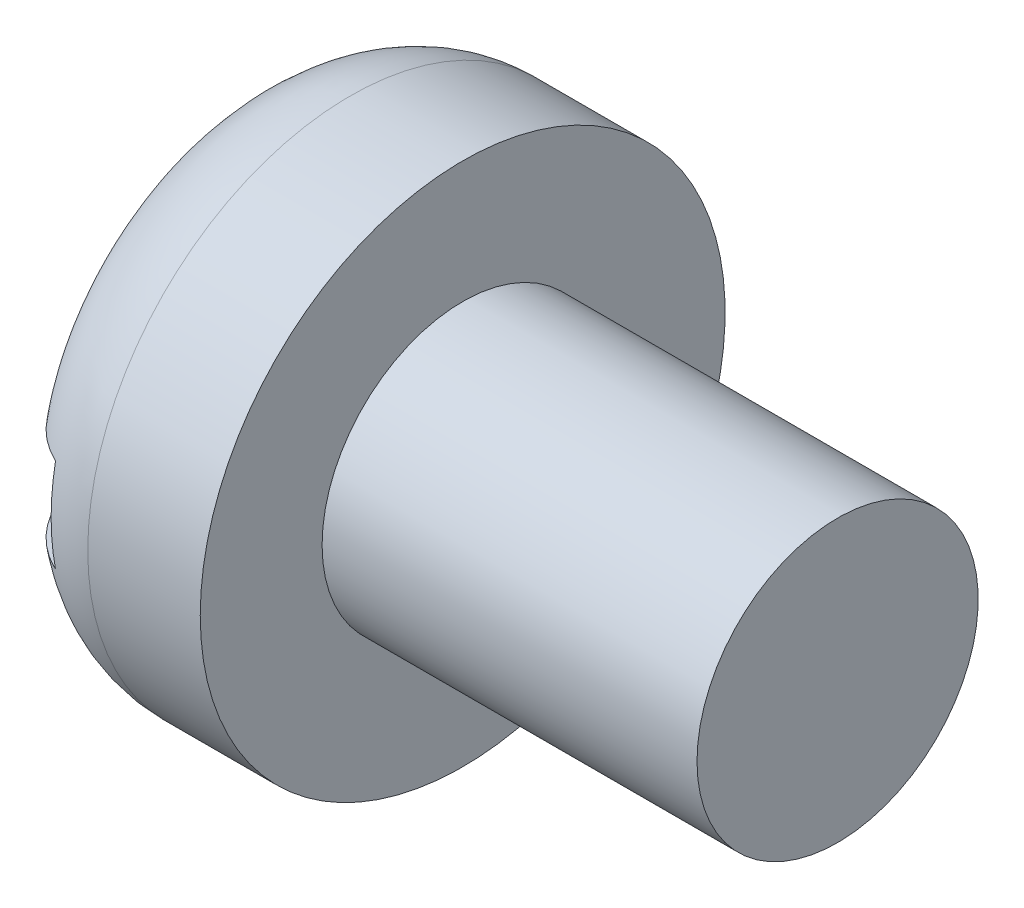
ISO-10303-21;
HEADER;
FILE_DESCRIPTION(('STEP AP214'),'2;1');
FILE_NAME('part.step','',(''),(''),'','','');
FILE_SCHEMA(('AUTOMOTIVE_DESIGN { 1 0 10303 214 1 1 1 1 }'));
ENDSEC;
DATA;
#1=APPLICATION_CONTEXT('core data for automotive mechanical design processes');
#2=APPLICATION_PROTOCOL_DEFINITION('international standard','automotive_design',2000,#1);
#3=PRODUCT_CONTEXT('',#1,'mechanical');
#4=PRODUCT('Part','Part','',(#3));
#5=PRODUCT_RELATED_PRODUCT_CATEGORY('part','',(#4));
#6=PRODUCT_DEFINITION_FORMATION('','',#4);
#7=PRODUCT_DEFINITION_CONTEXT('part definition',#1,'design');
#8=PRODUCT_DEFINITION('design','',#6,#7);
#9=PRODUCT_DEFINITION_SHAPE('','',#8);
#10=(LENGTH_UNIT() NAMED_UNIT(*) SI_UNIT(.MILLI.,.METRE.));
#11=(NAMED_UNIT(*) PLANE_ANGLE_UNIT() SI_UNIT($,.RADIAN.));
#12=(NAMED_UNIT(*) SI_UNIT($,.STERADIAN.) SOLID_ANGLE_UNIT());
#13=UNCERTAINTY_MEASURE_WITH_UNIT(LENGTH_MEASURE(1.E-05),#10,'distance_accuracy_value','');
#14=(GEOMETRIC_REPRESENTATION_CONTEXT(3) GLOBAL_UNCERTAINTY_ASSIGNED_CONTEXT((#13)) GLOBAL_UNIT_ASSIGNED_CONTEXT((#10,
#11,#12)) REPRESENTATION_CONTEXT('',''));
#15=CARTESIAN_POINT('',(0.,0.,0.));
#16=DIRECTION('',(0.,0.,1.));
#17=DIRECTION('',(1.,0.,0.));
#18=AXIS2_PLACEMENT_3D('',#15,#16,#17);
#19=CARTESIAN_POINT('',(-8.62126978980238,12.9032664543206,13.9354489302201));
#20=DIRECTION('',(-1.,0.,0.));
#21=DIRECTION('',(0.,0.,1.));
#22=AXIS2_PLACEMENT_3D('',#19,#20,#21);
#23=PLANE('',#22);
#24=DIRECTION('',(0.,0.,-1.));
#25=VECTOR('',#24,1.);
#26=CARTESIAN_POINT('',(-8.62126978980238,13.4032664543206,16.7354489302201));
#27=LINE('',#26,#25);
#28=CARTESIAN_POINT('',(-8.62126978980238,13.4032664543206,15.4553173455772));
#29=VERTEX_POINT('',#28);
#30=CARTESIAN_POINT('',(-8.62126978980238,13.4032664543206,12.4155805148631));
#31=VERTEX_POINT('',#30);
#32=EDGE_CURVE('E95',#29,#31,#27,.T.);
#33=ORIENTED_EDGE('',*,*,#32,.F.);
#34=CARTESIAN_POINT('',(-8.62126978980238,12.9032664543206,13.9354489302201));
#35=DIRECTION('',(-1.,0.,0.));
#36=DIRECTION('',(0.,0.,1.));
#37=AXIS2_PLACEMENT_3D('',#34,#35,#36);
#38=CIRCLE('',#37,1.6);
#39=EDGE_CURVE('E101',#29,#31,#38,.T.);
#40=ORIENTED_EDGE('',*,*,#39,.T.);
#41=EDGE_LOOP('',(#33,#40));
#42=FACE_BOUND('',#41,.T.);
#43=ADVANCED_FACE('F39',(#42),#23,.T.);
#44=CARTESIAN_POINT('',(-34.0212697898023,12.9032664543206,13.9354489302201));
#45=DIRECTION('',(-1.,0.,0.));
#46=DIRECTION('',(0.,0.,1.));
#47=AXIS2_PLACEMENT_3D('',#44,#45,#46);
#48=CYLINDRICAL_SURFACE('',#47,1.5);
#49=CARTESIAN_POINT('',(-2.22126978980237,12.9032664543206,13.9354489302201));
#50=DIRECTION('',(-1.,0.,0.));
#51=DIRECTION('',(0.,0.,1.));
#52=AXIS2_PLACEMENT_3D('',#49,#50,#51);
#53=CIRCLE('',#52,1.5);
#54=CARTESIAN_POINT('',(-2.22126978980237,12.9032664543206,15.4354489302201));
#55=VERTEX_POINT('',#54);
#56=EDGE_CURVE('E105',#55,#55,#53,.T.);
#57=ORIENTED_EDGE('',*,*,#56,.T.);
#58=EDGE_LOOP('',(#57));
#59=FACE_BOUND('',#58,.T.);
#60=CARTESIAN_POINT('',(-6.22126978980238,12.9032664543206,13.9354489302201));
#61=DIRECTION('',(-1.,0.,0.));
#62=DIRECTION('',(0.,0.,1.));
#63=AXIS2_PLACEMENT_3D('',#60,#61,#62);
#64=CIRCLE('',#63,1.5);
#65=CARTESIAN_POINT('',(-6.22126978980238,12.9032664543206,15.4354489302201));
#66=VERTEX_POINT('',#65);
#67=EDGE_CURVE('E160',#66,#66,#64,.T.);
#68=ORIENTED_EDGE('',*,*,#67,.F.);
#69=EDGE_LOOP('',(#68));
#70=FACE_BOUND('',#69,.T.);
#71=ADVANCED_FACE('F41',(#59,#70),#48,.T.);
#72=CARTESIAN_POINT('',(-2.22126978980238,14.4032664543206,13.9354489302201));
#73=DIRECTION('',(1.,0.,0.));
#74=DIRECTION('',(0.,0.,-1.));
#75=AXIS2_PLACEMENT_3D('',#72,#73,#74);
#76=PLANE('',#75);
#77=ORIENTED_EDGE('',*,*,#56,.F.);
#78=EDGE_LOOP('',(#77));
#79=FACE_BOUND('',#78,.T.);
#80=ADVANCED_FACE('F146',(#79),#76,.T.);
#81=DIRECTION('',(0.,0.,1.));
#82=VECTOR('',#81,1.);
#83=CARTESIAN_POINT('',(-8.62126978980238,12.4032664543206,11.1354489302201));
#84=LINE('',#83,#82);
#85=CARTESIAN_POINT('',(-8.62126978980238,12.4032664543206,12.4155805148631));
#86=VERTEX_POINT('',#85);
#87=CARTESIAN_POINT('',(-8.62126978980238,12.4032664543206,15.4553173455772));
#88=VERTEX_POINT('',#87);
#89=EDGE_CURVE('E85',#86,#88,#84,.T.);
#90=ORIENTED_EDGE('',*,*,#89,.F.);
#91=EDGE_CURVE('E93',#86,#88,#38,.T.);
#92=ORIENTED_EDGE('',*,*,#91,.T.);
#93=EDGE_LOOP('',(#90,#92));
#94=FACE_BOUND('',#93,.T.);
#95=ADVANCED_FACE('F92',(#94),#23,.T.);
#96=CARTESIAN_POINT('',(-7.42126978980238,12.9032664543206,13.9354489302201));
#97=DIRECTION('',(-1.,0.,0.));
#98=DIRECTION('',(0.,0.,1.));
#99=AXIS2_PLACEMENT_3D('',#96,#97,#98);
#100=TOROIDAL_SURFACE('',#99,1.6,1.2);
#101=CARTESIAN_POINT('',(-7.90085294213365,13.4032664543206,13.9354489302201));
#102=CARTESIAN_POINT('',(-7.90085774086287,13.4032664543206,13.9207700561548));
#103=CARTESIAN_POINT('',(-7.90236978474355,13.4032664543206,13.9060745708188));
#104=CARTESIAN_POINT('',(-7.90807348204163,13.4032664543206,13.8772174744059));
#105=CARTESIAN_POINT('',(-7.91227225294412,13.4032664543206,13.8630573875106));
#106=CARTESIAN_POINT('',(-7.92796057051941,13.4032664543206,13.8210389736919));
#107=CARTESIAN_POINT('',(-7.94248041727843,13.4032664543206,13.794365376126));
#108=CARTESIAN_POINT('',(-7.96673861728212,13.4032664543206,13.7559688914534));
#109=CARTESIAN_POINT('',(-7.97529780298517,13.4032664543206,13.743367120509));
#110=CARTESIAN_POINT('',(-7.99297687620366,13.4032664543206,13.7185615003034));
#111=CARTESIAN_POINT('',(-8.00209628912475,13.4032664543206,13.706357327275));
#112=CARTESIAN_POINT('',(-8.03198069437786,13.4032664543206,13.6674933601979));
#113=CARTESIAN_POINT('',(-8.05339185943502,13.4032664543206,13.6413452060081));
#114=CARTESIAN_POINT('',(-8.0965721980711,13.4032664543206,13.5893416754904));
#115=CARTESIAN_POINT('',(-8.11834148944553,13.4032664543206,13.5634864004172));
#116=CARTESIAN_POINT('',(-8.16161444185212,13.4032664543206,13.5115156841293));
#117=CARTESIAN_POINT('',(-8.18311788888295,13.4032664543206,13.4854000604564));
#118=CARTESIAN_POINT('',(-8.22541941949042,13.4032664543206,13.4326054661752));
#119=CARTESIAN_POINT('',(-8.24621754242922,13.4032664543206,13.4059265271392));
#120=CARTESIAN_POINT('',(-8.30659374913807,13.4032664543206,13.3253768219228));
#121=CARTESIAN_POINT('',(-8.34469746498546,13.4032664543206,13.2703712163407));
#122=CARTESIAN_POINT('',(-8.41506619711878,13.4032664543206,13.1567082854547));
#123=CARTESIAN_POINT('',(-8.44733402234661,13.4032664543206,13.0980527353199));
#124=CARTESIAN_POINT('',(-8.49298245265236,13.4032664543206,13.0017825141678));
#125=CARTESIAN_POINT('',(-8.50871688454186,13.4032664543206,12.9652773591317));
#126=CARTESIAN_POINT('',(-8.5373585981778,13.4032664543206,12.8911891801994));
#127=CARTESIAN_POINT('',(-8.55026662333418,13.4032664543206,12.8536064426806));
#128=CARTESIAN_POINT('',(-8.5845267745186,13.4032664543206,12.7390320076271));
#129=CARTESIAN_POINT('',(-8.60123925095574,13.4032664543206,12.6605768916679));
#130=CARTESIAN_POINT('',(-8.62084959946803,13.4032664543206,12.5016621170629));
#131=CARTESIAN_POINT('',(-8.62369831823948,13.4032664543206,12.4211963413268));
#132=CARTESIAN_POINT('',(-8.61465935864009,13.4032664543206,12.2612203959827));
#133=CARTESIAN_POINT('',(-8.60280402555819,13.4032664543206,12.1817085159889));
#134=CARTESIAN_POINT('',(-8.56574191107133,13.4032664543206,12.0320679605986));
#135=CARTESIAN_POINT('',(-8.541582068514,13.4032664543206,11.9616794020719));
#136=CARTESIAN_POINT('',(-8.48105346097416,13.4032664543206,11.8263124091358));
#137=CARTESIAN_POINT('',(-8.44468191463115,13.4032664543206,11.7613352114395));
#138=CARTESIAN_POINT('',(-8.36320201685977,13.4032664543206,11.6426527054337));
#139=CARTESIAN_POINT('',(-8.3187288882526,13.4032664543206,11.588510459511));
#140=CARTESIAN_POINT('',(-8.22109004817908,13.4032664543206,11.4887483825725));
#141=CARTESIAN_POINT('',(-8.16792741624445,13.4032664543206,11.4431255445341));
#142=CARTESIAN_POINT('',(-8.05608484068025,13.4032664543206,11.3630166042166));
#143=CARTESIAN_POINT('',(-7.99760596117162,13.4032664543206,11.3282495241293));
#144=CARTESIAN_POINT('',(-7.87557556893947,13.4032664543206,11.2691897802115));
#145=CARTESIAN_POINT('',(-7.81202432249974,13.4032664543206,11.2448965669629));
#146=CARTESIAN_POINT('',(-7.68263668714199,13.4032664543206,11.2078048736368));
#147=CARTESIAN_POINT('',(-7.61684588763204,13.4032664543206,11.1948472070679));
#148=CARTESIAN_POINT('',(-7.48402206791894,13.4032664543206,11.1802314094072));
#149=CARTESIAN_POINT('',(-7.41698911056628,13.4032664543206,11.1785727081689));
#150=CARTESIAN_POINT('',(-7.28399031470777,13.4032664543206,11.186580993782));
#151=CARTESIAN_POINT('',(-7.21802056506637,13.4032664543206,11.1961832358886));
#152=CARTESIAN_POINT('',(-7.0886283979501,13.4032664543206,11.2263184604466));
#153=CARTESIAN_POINT('',(-7.02520595919105,13.4032664543206,11.246851351546));
#154=CARTESIAN_POINT('',(-6.90263755070669,13.4032664543206,11.2982580502464));
#155=CARTESIAN_POINT('',(-6.8434953696309,13.4032664543206,11.3291408861573));
#156=CARTESIAN_POINT('',(-6.73118555678305,13.4032664543206,11.4003266101143));
#157=CARTESIAN_POINT('',(-6.67801801928743,13.4032664543206,11.4406296467748));
#158=CARTESIAN_POINT('',(-6.57871069545236,13.4032664543206,11.5298139226198));
#159=CARTESIAN_POINT('',(-6.53262744529518,13.4032664543206,11.5787580834511));
#160=CARTESIAN_POINT('',(-6.44917778926848,13.4032664543206,11.6835797179263));
#161=CARTESIAN_POINT('',(-6.41181187095342,13.4032664543206,11.7394575790997));
#162=CARTESIAN_POINT('',(-6.3461541813335,13.4032664543206,11.8575197236352));
#163=CARTESIAN_POINT('',(-6.31802232763197,13.4032664543206,11.9197928594399));
#164=CARTESIAN_POINT('',(-6.27227458178844,13.4032664543206,12.0480769361355));
#165=CARTESIAN_POINT('',(-6.25465932235245,13.4032664543206,12.1140881016547));
#166=CARTESIAN_POINT('',(-6.22977576484833,13.4032664543206,12.2501247750068));
#167=CARTESIAN_POINT('',(-6.22284243413007,13.4032664543206,12.3202113056099));
#168=CARTESIAN_POINT('',(-6.22017481316224,13.4032664543206,12.4605845886578));
#169=CARTESIAN_POINT('',(-6.22444307038412,13.4032664543206,12.5308713830155));
#170=CARTESIAN_POINT('',(-6.24413699000431,13.4032664543206,12.6740071935114));
#171=CARTESIAN_POINT('',(-6.26019602126574,13.4032664543206,12.7467680600471));
#172=CARTESIAN_POINT('',(-6.3029958659438,13.4032664543206,12.8890162106427));
#173=CARTESIAN_POINT('',(-6.32973644392663,13.4032664543206,12.9585035668168));
#174=CARTESIAN_POINT('',(-6.39306439692824,13.4032664543206,13.0948064730663));
#175=CARTESIAN_POINT('',(-6.42987135413187,13.4032664543206,13.1615188118044));
#176=CARTESIAN_POINT('',(-6.49058124755651,13.4032664543206,13.2580246723801));
#177=CARTESIAN_POINT('',(-6.51173871692347,13.4032664543206,13.2896048295829));
#178=CARTESIAN_POINT('',(-6.55556858080011,13.4032664543206,13.3516972767735));
#179=CARTESIAN_POINT('',(-6.57824097049212,13.4032664543206,13.3822095701567));
#180=CARTESIAN_POINT('',(-6.62786457158681,13.4032664543206,13.4464197430815));
#181=CARTESIAN_POINT('',(-6.65497952846902,13.4032664543206,13.4799896994943));
#182=CARTESIAN_POINT('',(-6.70994686125646,13.4032664543206,13.5465490247323));
#183=CARTESIAN_POINT('',(-6.73779979589247,13.4032664543206,13.5795379202382));
#184=CARTESIAN_POINT('',(-6.78818952285115,13.4032664543206,13.6401647437155));
#185=CARTESIAN_POINT('',(-6.81080620563631,13.4032664543206,13.6677323885419));
#186=CARTESIAN_POINT('',(-6.84332969599299,13.4032664543206,13.7101550846681));
#187=CARTESIAN_POINT('',(-6.85393264422941,13.4032664543206,13.7244675859466));
#188=CARTESIAN_POINT('',(-6.87430159212046,13.4032664543206,13.7536702582963));
#189=CARTESIAN_POINT('',(-6.88406833688208,13.4032664543206,13.7685598975458));
#190=CARTESIAN_POINT('',(-6.90116269253166,13.4032664543206,13.7974418591507));
#191=CARTESIAN_POINT('',(-6.90864146158441,13.4032664543206,13.8113426678094));
#192=CARTESIAN_POINT('',(-6.92183641253579,13.4032664543206,13.8399630605979));
#193=CARTESIAN_POINT('',(-6.92755598566147,13.4032664543206,13.8546810040088));
#194=CARTESIAN_POINT('',(-6.93558763628182,13.4032664543206,13.8822442213006));
#195=CARTESIAN_POINT('',(-6.93832302379243,13.4032664543206,13.8949613696246));
#196=CARTESIAN_POINT('',(-6.94155799606016,13.4032664543206,13.9206728256305));
#197=CARTESIAN_POINT('',(-6.94206104040338,13.4032664543206,13.933666673068));
#198=CARTESIAN_POINT('',(-6.94074227533285,13.4032664543206,13.9595297200351));
#199=CARTESIAN_POINT('',(-6.93892036940785,13.4032664543206,13.9723989143679));
#200=CARTESIAN_POINT('',(-6.9332760988262,13.4032664543206,13.9976838046403));
#201=CARTESIAN_POINT('',(-6.9294513865709,13.4032664543206,14.0100989500547));
#202=CARTESIAN_POINT('',(-6.91427979018474,13.4032664543206,14.0504800871274));
#203=CARTESIAN_POINT('',(-6.89969195705445,13.4032664543206,14.0771807004338));
#204=CARTESIAN_POINT('',(-6.87534139976088,13.4032664543206,14.1156220814264));
#205=CARTESIAN_POINT('',(-6.86675099032244,13.4032664543206,14.1282419100613));
#206=CARTESIAN_POINT('',(-6.84901219698893,13.4032664543206,14.153084814463));
#207=CARTESIAN_POINT('',(-6.83986430161381,13.4032664543206,14.165308223615));
#208=CARTESIAN_POINT('',(-6.80979058850324,13.4032664543206,14.2043682238499));
#209=CARTESIAN_POINT('',(-6.78821535651869,13.4032664543206,14.2306897213065));
#210=CARTESIAN_POINT('',(-6.74471699751794,13.4032664543206,14.2830482293595));
#211=CARTESIAN_POINT('',(-6.72279375838161,13.4032664543206,14.3090851435124));
#212=CARTESIAN_POINT('',(-6.6792292168459,13.4032664543206,14.3614328197513));
#213=CARTESIAN_POINT('',(-6.65758813945204,13.4032664543206,14.3877437734875));
#214=CARTESIAN_POINT('',(-6.61503247747752,13.4032664543206,14.4409449327774));
#215=CARTESIAN_POINT('',(-6.59411785122268,13.4032664543206,14.4678351049594));
#216=CARTESIAN_POINT('',(-6.5334403756983,13.4032664543206,14.5490273743724));
#217=CARTESIAN_POINT('',(-6.49518719561483,13.4032664543206,14.604488243805));
#218=CARTESIAN_POINT('',(-6.42464209768938,13.4032664543206,14.7191168856215));
#219=CARTESIAN_POINT('',(-6.39234728253885,13.4032664543206,14.7782828375291));
#220=CARTESIAN_POINT('',(-6.34693258440414,13.4032664543206,14.8750470990188));
#221=CARTESIAN_POINT('',(-6.33138733536718,13.4032664543206,14.9115143883737));
#222=CARTESIAN_POINT('',(-6.30312123693577,13.4032664543206,14.9855125255462));
#223=CARTESIAN_POINT('',(-6.29039961936538,13.4032664543206,15.0230430809588));
#224=CARTESIAN_POINT('',(-6.25668900119055,13.4032664543206,15.1374445812549));
#225=CARTESIAN_POINT('',(-6.24033141717665,13.4032664543206,15.2157557129305));
#226=CARTESIAN_POINT('',(-6.22138376140658,13.4032664543206,15.3743125948024));
#227=CARTESIAN_POINT('',(-6.21884115549233,13.4032664543206,15.4545640645342));
#228=CARTESIAN_POINT('',(-6.22841819103213,13.4032664543206,15.6140608976651));
#229=CARTESIAN_POINT('',(-6.24050522628888,13.4032664543206,15.6933081021471));
#230=CARTESIAN_POINT('',(-6.27796472873051,13.4032664543206,15.842552835601));
#231=CARTESIAN_POINT('',(-6.30232098752054,13.4032664543206,15.9128059525169));
#232=CARTESIAN_POINT('',(-6.36320939089352,13.4032664543206,16.0478734291789));
#233=CARTESIAN_POINT('',(-6.39974452324173,13.4032664543206,16.1126864494519));
#234=CARTESIAN_POINT('',(-6.48152400271643,13.4032664543206,16.231057915957));
#235=CARTESIAN_POINT('',(-6.52614025426223,13.4032664543206,16.2850511129128));
#236=CARTESIAN_POINT('',(-6.62403576429067,13.4032664543206,16.3844940872971));
#237=CARTESIAN_POINT('',(-6.67731193589938,13.4032664543206,16.4299468965905));
#238=CARTESIAN_POINT('',(-6.78935565104567,13.4032664543206,16.5097130085561));
#239=CARTESIAN_POINT('',(-6.84792422699949,13.4032664543206,16.544306055188));
#240=CARTESIAN_POINT('',(-6.97010268828674,13.4032664543206,16.603006021156));
#241=CARTESIAN_POINT('',(-7.03371231519525,13.4032664543206,16.6271134776159));
#242=CARTESIAN_POINT('',(-7.1631889065881,13.4032664543206,16.6638321507011));
#243=CARTESIAN_POINT('',(-7.22901102180633,13.4032664543206,16.6766016699606));
#244=CARTESIAN_POINT('',(-7.36186521878411,13.4032664543206,16.690839306986));
#245=CARTESIAN_POINT('',(-7.42889723972434,13.4032664543206,16.6923079912431));
#246=CARTESIAN_POINT('',(-7.56186632604393,13.4032664543206,16.6839243901631));
#247=CARTESIAN_POINT('',(-7.62780744192343,13.4032664543206,16.6741361500274));
#248=CARTESIAN_POINT('',(-7.75711168655319,13.4032664543206,16.6436369747763));
#249=CARTESIAN_POINT('',(-7.82047483788073,13.4032664543206,16.622926135341));
#250=CARTESIAN_POINT('',(-7.94289931006731,13.4032664543206,16.5711753035781));
#251=CARTESIAN_POINT('',(-8.00195658956185,13.4032664543206,16.5401257559772));
#252=CARTESIAN_POINT('',(-8.11407059121581,13.4032664543206,16.4686235855085));
#253=CARTESIAN_POINT('',(-8.167127201662,13.4032664543206,16.428170787625));
#254=CARTESIAN_POINT('',(-8.26619254011802,13.4032664543206,16.3387042169177));
#255=CARTESIAN_POINT('',(-8.31214407114585,13.4032664543206,16.2896271425639));
#256=CARTESIAN_POINT('',(-8.39531057629076,13.4032664543206,16.184564308358));
#257=CARTESIAN_POINT('',(-8.43252513971609,13.4032664543206,16.1285782239282));
#258=CARTESIAN_POINT('',(-8.49786612387462,13.4032664543206,16.0103202012454));
#259=CARTESIAN_POINT('',(-8.5258316028531,13.4032664543206,15.9479594209508));
#260=CARTESIAN_POINT('',(-8.57123707584149,13.4032664543206,15.8195269979551));
#261=CARTESIAN_POINT('',(-8.58867612885254,13.4032664543206,15.7534550240727));
#262=CARTESIAN_POINT('',(-8.6131994299016,13.4032664543206,15.6173121898606));
#263=CARTESIAN_POINT('',(-8.6199465497701,13.4032664543206,15.5471808540449));
#264=CARTESIAN_POINT('',(-8.62224007010626,13.4032664543206,15.4067533679657));
#265=CARTESIAN_POINT('',(-8.61778477207847,13.4032664543206,15.3364571943243));
#266=CARTESIAN_POINT('',(-8.59771049751408,13.4032664543206,15.1933097530825));
#267=CARTESIAN_POINT('',(-8.58145533487924,13.4032664543206,15.1205487105746));
#268=CARTESIAN_POINT('',(-8.53827187434578,13.4032664543206,14.9783166607717));
#269=CARTESIAN_POINT('',(-8.51134228528472,13.4032664543206,14.908846052621));
#270=CARTESIAN_POINT('',(-8.44703794735481,13.4032664543206,14.771288165837));
#271=CARTESIAN_POINT('',(-8.40926196256924,13.4032664543206,14.7033905343951));
#272=CARTESIAN_POINT('',(-8.34694510836873,13.4032664543206,14.605242406797));
#273=CARTESIAN_POINT('',(-8.32522536255786,13.4032664543206,14.5731362003976));
#274=CARTESIAN_POINT('',(-8.28024837085333,13.4032664543206,14.5100170430605));
#275=CARTESIAN_POINT('',(-8.25699113294042,13.4032664543206,14.4790040864493));
#276=CARTESIAN_POINT('',(-8.19955402676887,13.4032664543206,14.4053392868432));
#277=CARTESIAN_POINT('',(-8.16480888417526,13.4032664543206,14.3631346373795));
#278=CARTESIAN_POINT('',(-8.11226932596206,13.4032664543206,14.3001879004722));
#279=CARTESIAN_POINT('',(-8.09468334865108,13.4032664543206,14.2792627991109));
#280=CARTESIAN_POINT('',(-8.05974351799829,13.4032664543206,14.2372200236109));
#281=CARTESIAN_POINT('',(-8.04238962078138,13.4032664543206,14.2161023871779));
#282=CARTESIAN_POINT('',(-8.00991975902036,13.4032664543206,14.1749917315742));
#283=CARTESIAN_POINT('',(-7.99473771068591,13.4032664543206,14.155051268081));
#284=CARTESIAN_POINT('',(-7.96590644003189,13.4032664543206,14.1140340118232));
#285=CARTESIAN_POINT('',(-7.95225688246086,13.4032664543206,14.0929574690891));
#286=CARTESIAN_POINT('',(-7.9325563565811,13.4032664543206,14.0568138822776));
#287=CARTESIAN_POINT('',(-7.92553330674445,13.4032664543206,14.042291801402));
#288=CARTESIAN_POINT('',(-7.91370276396756,13.4032664543206,14.0123813076468));
#289=CARTESIAN_POINT('',(-7.90888618584614,13.4032664543206,13.996996745447));
#290=CARTESIAN_POINT('',(-7.90407438409788,13.4032664543206,13.9737552643491));
#291=CARTESIAN_POINT('',(-7.90287448652142,13.4032664543206,13.9661451996314));
#292=CARTESIAN_POINT('',(-7.90126248537603,13.4032664543206,13.9508412594348));
#293=CARTESIAN_POINT('',(-7.90085042540296,13.4032664543206,13.9431473793417));
#294=CARTESIAN_POINT('',(-7.90085294213365,13.4032664543206,13.9354489302201));
#295=B_SPLINE_CURVE_WITH_KNOTS('',3,(#101,#102,#103,#104,#105,#106,#107,#108,#109,#110,#111,
#112,#113,#114,#115,#116,#117,#118,#119,#120,#121,#122,#123,#124,#125,#126,#127,#128,#129,#130,
#131,#132,#133,#134,#135,#136,#137,#138,#139,#140,#141,#142,#143,#144,#145,#146,#147,#148,#149,
#150,#151,#152,#153,#154,#155,#156,#157,#158,#159,#160,#161,#162,#163,#164,#165,#166,#167,#168,
#169,#170,#171,#172,#173,#174,#175,#176,#177,#178,#179,#180,#181,#182,#183,#184,#185,#186,#187,
#188,#189,#190,#191,#192,#193,#194,#195,#196,#197,#198,#199,#200,#201,#202,#203,#204,#205,#206,
#207,#208,#209,#210,#211,#212,#213,#214,#215,#216,#217,#218,#219,#220,#221,#222,#223,#224,#225,
#226,#227,#228,#229,#230,#231,#232,#233,#234,#235,#236,#237,#238,#239,#240,#241,#242,#243,#244,
#245,#246,#247,#248,#249,#250,#251,#252,#253,#254,#255,#256,#257,#258,#259,#260,#261,#262,#263,
#264,#265,#266,#267,#268,#269,#270,#271,#272,#273,#274,#275,#276,#277,#278,#279,#280,#281,#282,
#283,#284,#285,#286,#287,#288,#289,#290,#291,#292,#293,#294),.UNSPECIFIED.,.T.,.F.,(4,2,2,2,2,2,
2,2,2,2,2,2,2,2,2,2,2,2,2,2,2,2,2,2,2,2,2,2,2,2,2,2,2,2,2,2,2,2,2,2,2,2,2,2,2,2,2,2,2,2,2,2,2,2,
2,2,2,2,2,2,2,2,2,2,2,2,2,2,2,2,2,2,2,2,2,2,2,2,2,2,2,2,2,2,2,2,2,2,2,2,2,2,2,2,2,2,4),(0.,
0.0440007777412272,0.0881186045072447,0.17843988360583,0.224162667229452,0.269847237288858,
0.371215673713099,0.472618146887276,0.574097532607897,0.675571245698376,0.876045230357639,
1.0764224642004,1.19557056112833,1.31468728162283,1.55411672058772,1.79439443006589,
2.03414452398769,2.2562481790515,2.47840245521465,2.68756673920361,2.89665705613686,
3.09977266560001,3.30287761911756,3.5030823178623,3.70327691419208,3.90232611273859,
4.10137364777366,4.30059526689212,4.49982002917179,4.70056028055691,4.90131175651788,
5.10537604680918,5.30945261290896,5.51980706790487,5.7302093659751,5.95282679378429,
6.17543931511553,6.40335976126923,6.51736063431678,6.63136114484171,6.76079428687683,
6.8903283943374,6.99726917064713,7.05068967310567,7.10406206826363,7.15134355972005,
7.19853332630836,7.23739190284074,7.27619023700202,7.31499018177751,7.3538357082276,
7.44431654217294,7.49013797501704,7.5359198167588,7.6380029896461,7.74011974728093,
7.84231348847882,7.94450135743467,8.14634438291939,8.34808900024257,8.46690950349591,
8.58569764160732,8.82449008606957,9.06410246310475,9.30318177972386,9.52509515660907,
9.74706301419966,9.95615575991352,10.1651741362098,10.3682553552598,10.5713261702611,
10.7715149375745,10.9716936697075,11.1707391146132,11.3697828159444,11.569010991056,
11.7682428745474,11.9690033344313,12.1697732294154,12.3738724766404,12.5779899664035,
12.7884238578578,12.998889656938,13.2216352359063,13.4444077660683,13.6768112621136,
13.793063359413,13.9093148533232,14.0732787980676,14.155283663766,14.237272800687,
14.312442415383,14.3875955536153,14.4358843891868,14.4839725669985,14.5070478386022,
14.5301243870649),.UNSPECIFIED.);
#296=CARTESIAN_POINT('',(-7.92126978980238,13.4032664543206,11.2914391199729));
#297=VERTEX_POINT('',#296);
#298=EDGE_CURVE('E11',#31,#297,#295,.T.);
#299=ORIENTED_EDGE('',*,*,#298,.F.);
#300=ORIENTED_EDGE('',*,*,#39,.F.);
#301=CARTESIAN_POINT('',(-7.92126978980238,13.4032664543206,16.5794587404673));
#302=VERTEX_POINT('',#301);
#303=EDGE_CURVE('E43',#302,#29,#295,.T.);
#304=ORIENTED_EDGE('',*,*,#303,.F.);
#305=CARTESIAN_POINT('',(-7.92126978980238,12.9032664543206,13.9354489302201));
#306=DIRECTION('',(-1.,0.,0.));
#307=DIRECTION('',(0.,0.,1.));
#308=AXIS2_PLACEMENT_3D('',#305,#306,#307);
#309=CIRCLE('',#308,2.69087121146357);
#310=CARTESIAN_POINT('',(-7.92126978980238,12.4032664543206,16.5794587404673));
#311=VERTEX_POINT('',#310);
#312=EDGE_CURVE('E113',#302,#311,#309,.F.);
#313=ORIENTED_EDGE('',*,*,#312,.T.);
#314=CARTESIAN_POINT('',(-7.90085294213365,12.4032664543206,13.9354489302201));
#315=CARTESIAN_POINT('',(-7.90085774086287,12.4032664543206,13.9501278042855));
#316=CARTESIAN_POINT('',(-7.90236978474355,12.4032664543206,13.9648232896215));
#317=CARTESIAN_POINT('',(-7.90807348204163,12.4032664543206,13.9936803860344));
#318=CARTESIAN_POINT('',(-7.91227225294412,12.4032664543206,14.0078404729296));
#319=CARTESIAN_POINT('',(-7.92796057051941,12.4032664543206,14.0498588867484));
#320=CARTESIAN_POINT('',(-7.94248041727843,12.4032664543206,14.0765324843143));
#321=CARTESIAN_POINT('',(-7.96673861728211,12.4032664543206,14.1149289689868));
#322=CARTESIAN_POINT('',(-7.97529780298517,12.4032664543206,14.1275307399312));
#323=CARTESIAN_POINT('',(-7.99297687620366,12.4032664543206,14.1523363601369));
#324=CARTESIAN_POINT('',(-8.00209628912475,12.4032664543206,14.1645405331653));
#325=CARTESIAN_POINT('',(-8.03198069437786,12.4032664543206,14.2034045002424));
#326=CARTESIAN_POINT('',(-8.05339185943502,12.4032664543206,14.2295526544321));
#327=CARTESIAN_POINT('',(-8.09657219807109,12.4032664543206,14.2815561849499));
#328=CARTESIAN_POINT('',(-8.11834148944552,12.4032664543206,14.3074114600231));
#329=CARTESIAN_POINT('',(-8.16161444185212,12.4032664543206,14.359382176311));
#330=CARTESIAN_POINT('',(-8.18311788888294,12.4032664543206,14.3854977999839));
#331=CARTESIAN_POINT('',(-8.22541941949041,12.4032664543206,14.4382923942651));
#332=CARTESIAN_POINT('',(-8.24621754242921,12.4032664543206,14.4649713333011));
#333=CARTESIAN_POINT('',(-8.30659374913805,12.4032664543206,14.5455210385175));
#334=CARTESIAN_POINT('',(-8.34469746498545,12.4032664543206,14.6005266440995));
#335=CARTESIAN_POINT('',(-8.41506619711877,12.4032664543206,14.7141895749855));
#336=CARTESIAN_POINT('',(-8.44733402234659,12.4032664543206,14.7728451251203));
#337=CARTESIAN_POINT('',(-8.49298245265235,12.4032664543206,14.8691153462724));
#338=CARTESIAN_POINT('',(-8.50871688454185,12.4032664543206,14.9056205013085));
#339=CARTESIAN_POINT('',(-8.53735859817779,12.4032664543206,14.9797086802408));
#340=CARTESIAN_POINT('',(-8.55026662333417,12.4032664543206,15.0172914177597));
#341=CARTESIAN_POINT('',(-8.58452677451859,12.4032664543206,15.1318658528132));
#342=CARTESIAN_POINT('',(-8.60123925095574,12.4032664543206,15.2103209687724));
#343=CARTESIAN_POINT('',(-8.62084959946803,12.4032664543206,15.3692357433774));
#344=CARTESIAN_POINT('',(-8.62369831823948,12.4032664543206,15.4497015191134));
#345=CARTESIAN_POINT('',(-8.61465935864009,12.4032664543206,15.6096774644576));
#346=CARTESIAN_POINT('',(-8.6028040255582,12.4032664543206,15.6891893444514));
#347=CARTESIAN_POINT('',(-8.56574191107133,12.4032664543206,15.8388298998417));
#348=CARTESIAN_POINT('',(-8.54158206851401,12.4032664543206,15.9092184583683));
#349=CARTESIAN_POINT('',(-8.48105346097417,12.4032664543206,16.0445854513045));
#350=CARTESIAN_POINT('',(-8.44468191463116,12.4032664543206,16.1095626490008));
#351=CARTESIAN_POINT('',(-8.36320201685978,12.4032664543206,16.2282451550065));
#352=CARTESIAN_POINT('',(-8.31872888825261,12.4032664543206,16.2823874009292));
#353=CARTESIAN_POINT('',(-8.22109004817909,12.4032664543206,16.3821494778677));
#354=CARTESIAN_POINT('',(-8.16792741624446,12.4032664543206,16.4277723159061));
#355=CARTESIAN_POINT('',(-8.05608484068027,12.4032664543206,16.5078812562237));
#356=CARTESIAN_POINT('',(-7.99760596117164,12.4032664543206,16.542648336311));
#357=CARTESIAN_POINT('',(-7.87557556893949,12.4032664543206,16.6017080802288));
#358=CARTESIAN_POINT('',(-7.81202432249976,12.4032664543206,16.6260012934774));
#359=CARTESIAN_POINT('',(-7.682636687142,12.4032664543206,16.6630929868035));
#360=CARTESIAN_POINT('',(-7.61684588763206,12.4032664543206,16.6760506533724));
#361=CARTESIAN_POINT('',(-7.48402206791895,12.4032664543206,16.6906664510331));
#362=CARTESIAN_POINT('',(-7.41698911056629,12.4032664543206,16.6923251522714));
#363=CARTESIAN_POINT('',(-7.28399031470779,12.4032664543206,16.6843168666583));
#364=CARTESIAN_POINT('',(-7.21802056506639,12.4032664543206,16.6747146245517));
#365=CARTESIAN_POINT('',(-7.08862839795012,12.4032664543206,16.6445793999937));
#366=CARTESIAN_POINT('',(-7.02520595919106,12.4032664543206,16.6240465088943));
#367=CARTESIAN_POINT('',(-6.9026375507067,12.4032664543206,16.5726398101939));
#368=CARTESIAN_POINT('',(-6.84349536963091,12.4032664543206,16.541756974283));
#369=CARTESIAN_POINT('',(-6.73118555678306,12.4032664543206,16.470571250326));
#370=CARTESIAN_POINT('',(-6.67801801928744,12.4032664543206,16.4302682136655));
#371=CARTESIAN_POINT('',(-6.57871069545237,12.4032664543206,16.3410839378205));
#372=CARTESIAN_POINT('',(-6.53262744529519,12.4032664543206,16.2921397769892));
#373=CARTESIAN_POINT('',(-6.44917778926849,12.4032664543206,16.187318142514));
#374=CARTESIAN_POINT('',(-6.41181187095343,12.4032664543206,16.1314402813406));
#375=CARTESIAN_POINT('',(-6.3461541813335,12.4032664543206,16.0133781368051));
#376=CARTESIAN_POINT('',(-6.31802232763198,12.4032664543206,15.9511050010004));
#377=CARTESIAN_POINT('',(-6.27227458178845,12.4032664543206,15.8228209243048));
#378=CARTESIAN_POINT('',(-6.25465932235246,12.4032664543206,15.7568097587856));
#379=CARTESIAN_POINT('',(-6.22977576484833,12.4032664543206,15.6207730854335));
#380=CARTESIAN_POINT('',(-6.22284243413008,12.4032664543206,15.5506865548304));
#381=CARTESIAN_POINT('',(-6.22017481316224,12.4032664543206,15.4103132717825));
#382=CARTESIAN_POINT('',(-6.22444307038412,12.4032664543206,15.3400264774248));
#383=CARTESIAN_POINT('',(-6.2441369900043,12.4032664543206,15.1968906669289));
#384=CARTESIAN_POINT('',(-6.26019602126574,12.4032664543206,15.1241298003932));
#385=CARTESIAN_POINT('',(-6.30299586594379,12.4032664543206,14.9818816497976));
#386=CARTESIAN_POINT('',(-6.32973644392662,12.4032664543206,14.9123942936235));
#387=CARTESIAN_POINT('',(-6.39306439692823,12.4032664543206,14.776091387374));
#388=CARTESIAN_POINT('',(-6.42987135413185,12.4032664543206,14.7093790486359));
#389=CARTESIAN_POINT('',(-6.49058124755649,12.4032664543206,14.6128731880602));
#390=CARTESIAN_POINT('',(-6.51173871692344,12.4032664543206,14.5812930308574));
#391=CARTESIAN_POINT('',(-6.55556858080008,12.4032664543206,14.5192005836669));
#392=CARTESIAN_POINT('',(-6.57824097049209,12.4032664543206,14.4886882902836));
#393=CARTESIAN_POINT('',(-6.62786457158677,12.4032664543206,14.4244781173589));
#394=CARTESIAN_POINT('',(-6.65497952846898,12.4032664543206,14.3909081609461));
#395=CARTESIAN_POINT('',(-6.70994686125642,12.4032664543206,14.324348835708));
#396=CARTESIAN_POINT('',(-6.73779979589244,12.4032664543206,14.2913599402022));
#397=CARTESIAN_POINT('',(-6.78818952285111,12.4032664543206,14.2307331167248));
#398=CARTESIAN_POINT('',(-6.81080620563626,12.4032664543206,14.2031654718984));
#399=CARTESIAN_POINT('',(-6.84332969599293,12.4032664543206,14.1607427757723));
#400=CARTESIAN_POINT('',(-6.85393264422935,12.4032664543206,14.1464302744938));
#401=CARTESIAN_POINT('',(-6.87430159212039,12.4032664543206,14.117227602144));
#402=CARTESIAN_POINT('',(-6.88406833688201,12.4032664543206,14.1023379628946));
#403=CARTESIAN_POINT('',(-6.9011626925316,12.4032664543206,14.0734560012897));
#404=CARTESIAN_POINT('',(-6.90864146158435,12.4032664543206,14.059555192631));
#405=CARTESIAN_POINT('',(-6.92183641253574,12.4032664543206,14.0309347998425));
#406=CARTESIAN_POINT('',(-6.92755598566143,12.4032664543206,14.0162168564316));
#407=CARTESIAN_POINT('',(-6.93558763628179,12.4032664543206,13.9886536391398));
#408=CARTESIAN_POINT('',(-6.93832302379241,12.4032664543206,13.9759364908158));
#409=CARTESIAN_POINT('',(-6.94155799606015,12.4032664543206,13.9502250348099));
#410=CARTESIAN_POINT('',(-6.94206104040338,12.4032664543206,13.9372311873724));
#411=CARTESIAN_POINT('',(-6.94074227533286,12.4032664543206,13.9113681404053));
#412=CARTESIAN_POINT('',(-6.93892036940786,12.4032664543206,13.8984989460725));
#413=CARTESIAN_POINT('',(-6.93327609882622,12.4032664543206,13.8732140558001));
#414=CARTESIAN_POINT('',(-6.92945138657092,12.4032664543206,13.8607989103856));
#415=CARTESIAN_POINT('',(-6.91427979018478,12.4032664543206,13.820417773313));
#416=CARTESIAN_POINT('',(-6.89969195705451,12.4032664543206,13.7937171600066));
#417=CARTESIAN_POINT('',(-6.87534139976098,12.4032664543206,13.755275779014));
#418=CARTESIAN_POINT('',(-6.86675099032256,12.4032664543206,13.7426559503792));
#419=CARTESIAN_POINT('',(-6.84901219698907,12.4032664543206,13.7178130459775));
#420=CARTESIAN_POINT('',(-6.83986430161396,12.4032664543206,13.7055896368255));
#421=CARTESIAN_POINT('',(-6.80979058850344,12.4032664543206,13.6665296365906));
#422=CARTESIAN_POINT('',(-6.78821535651892,12.4032664543206,13.6402081391341));
#423=CARTESIAN_POINT('',(-6.74471699751823,12.4032664543206,13.5878496310812));
#424=CARTESIAN_POINT('',(-6.72279375838194,12.4032664543206,13.5618127169282));
#425=CARTESIAN_POINT('',(-6.67922921684627,12.4032664543206,13.5094650406894));
#426=CARTESIAN_POINT('',(-6.65758813945244,12.4032664543206,13.4831540869533));
#427=CARTESIAN_POINT('',(-6.61503247747797,12.4032664543206,13.4299529276635));
#428=CARTESIAN_POINT('',(-6.59411785122315,12.4032664543206,13.4030627554815));
#429=CARTESIAN_POINT('',(-6.53344037569882,12.4032664543206,13.3218704860686));
#430=CARTESIAN_POINT('',(-6.49518719561539,12.4032664543206,13.2664096166361));
#431=CARTESIAN_POINT('',(-6.42464209768996,12.4032664543206,13.1517809748198));
#432=CARTESIAN_POINT('',(-6.39234728253944,12.4032664543206,13.0926150229123));
#433=CARTESIAN_POINT('',(-6.34693258440467,12.4032664543206,12.9958507614227));
#434=CARTESIAN_POINT('',(-6.33138733536768,12.4032664543206,12.9593834720678));
#435=CARTESIAN_POINT('',(-6.30312123693619,12.4032664543206,12.8853853348953));
#436=CARTESIAN_POINT('',(-6.29039961936576,12.4032664543206,12.8478547794827));
#437=CARTESIAN_POINT('',(-6.25668900119082,12.4032664543206,12.7334532791866));
#438=CARTESIAN_POINT('',(-6.24033141717685,12.4032664543206,12.6551421475109));
#439=CARTESIAN_POINT('',(-6.22138376140664,12.4032664543206,12.4965852656389));
#440=CARTESIAN_POINT('',(-6.21884115549233,12.4032664543206,12.4163337959071));
#441=CARTESIAN_POINT('',(-6.22841819103202,12.4032664543206,12.2568369627761));
#442=CARTESIAN_POINT('',(-6.24050522628872,12.4032664543206,12.177589758294));
#443=CARTESIAN_POINT('',(-6.27796472873027,12.4032664543206,12.02834502484));
#444=CARTESIAN_POINT('',(-6.30232098752025,12.4032664543206,11.9580919079241));
#445=CARTESIAN_POINT('',(-6.36320939089316,12.4032664543206,11.8230244312621));
#446=CARTESIAN_POINT('',(-6.39974452324133,12.4032664543206,11.7582114109891));
#447=CARTESIAN_POINT('',(-6.48152400271597,12.4032664543206,11.6398399444839));
#448=CARTESIAN_POINT('',(-6.52614025426174,12.4032664543206,11.585846747528));
#449=CARTESIAN_POINT('',(-6.62403576429013,12.4032664543206,11.4864037731436));
#450=CARTESIAN_POINT('',(-6.67731193589882,12.4032664543206,11.4409509638503));
#451=CARTESIAN_POINT('',(-6.78935565104507,12.4032664543206,11.3611848518845));
#452=CARTESIAN_POINT('',(-6.84792422699887,12.4032664543206,11.3265918052526));
#453=CARTESIAN_POINT('',(-6.97010268828608,12.4032664543206,11.2678918392845));
#454=CARTESIAN_POINT('',(-7.03371231519458,12.4032664543206,11.2437843828246));
#455=CARTESIAN_POINT('',(-7.16318890658741,12.4032664543206,11.2070657097394));
#456=CARTESIAN_POINT('',(-7.22901102180563,12.4032664543206,11.1942961904798));
#457=CARTESIAN_POINT('',(-7.36186521878341,12.4032664543206,11.1800585534543));
#458=CARTESIAN_POINT('',(-7.42889723972365,12.4032664543206,11.1785898691972));
#459=CARTESIAN_POINT('',(-7.56186632604324,12.4032664543206,11.1869734702771));
#460=CARTESIAN_POINT('',(-7.62780744192274,12.4032664543206,11.1967617104128));
#461=CARTESIAN_POINT('',(-7.75711168655252,12.4032664543206,11.2272608856638));
#462=CARTESIAN_POINT('',(-7.82047483788007,12.4032664543206,11.247971725099));
#463=CARTESIAN_POINT('',(-7.94289931006669,12.4032664543206,11.2997225568619));
#464=CARTESIAN_POINT('',(-8.00195658956124,12.4032664543206,11.3307721044627));
#465=CARTESIAN_POINT('',(-8.11407059121524,12.4032664543206,11.4022742749314));
#466=CARTESIAN_POINT('',(-8.16712720166146,12.4032664543206,11.4427270728149));
#467=CARTESIAN_POINT('',(-8.26619254011753,12.4032664543206,11.5321936435221));
#468=CARTESIAN_POINT('',(-8.31214407114539,12.4032664543206,11.5812707178759));
#469=CARTESIAN_POINT('',(-8.39531057629036,12.4032664543206,11.6863335520817));
#470=CARTESIAN_POINT('',(-8.43252513971572,12.4032664543206,11.7423196365115));
#471=CARTESIAN_POINT('',(-8.49786612387431,12.4032664543206,11.8605776591942));
#472=CARTESIAN_POINT('',(-8.52583160285283,12.4032664543206,11.9229384394888));
#473=CARTESIAN_POINT('',(-8.57123707584129,12.4032664543206,12.0513708624845));
#474=CARTESIAN_POINT('',(-8.58867612885237,12.4032664543206,12.1174428363669));
#475=CARTESIAN_POINT('',(-8.61319942990151,12.4032664543206,12.253585670579));
#476=CARTESIAN_POINT('',(-8.61994654977005,12.4032664543206,12.3237170063947));
#477=CARTESIAN_POINT('',(-8.62224007010628,12.4032664543206,12.4641444924738));
#478=CARTESIAN_POINT('',(-8.61778477207853,12.4032664543206,12.5344406661153));
#479=CARTESIAN_POINT('',(-8.59771049751423,12.4032664543206,12.677588107357));
#480=CARTESIAN_POINT('',(-8.58145533487942,12.4032664543206,12.7503491498649));
#481=CARTESIAN_POINT('',(-8.53827187434605,12.4032664543206,12.8925811996679));
#482=CARTESIAN_POINT('',(-8.51134228528503,12.4032664543206,12.9620518078186));
#483=CARTESIAN_POINT('',(-8.44703794735533,12.4032664543206,13.0996096946023));
#484=CARTESIAN_POINT('',(-8.40926196256996,12.4032664543206,13.1675073260439));
#485=CARTESIAN_POINT('',(-8.3469451083698,12.4032664543206,13.2656554536417));
#486=CARTESIAN_POINT('',(-8.32522536255905,12.4032664543206,13.2977616600409));
#487=CARTESIAN_POINT('',(-8.28024837085477,12.4032664543206,13.3608808173778));
#488=CARTESIAN_POINT('',(-8.25699113294199,12.4032664543206,13.391893773989));
#489=CARTESIAN_POINT('',(-8.19955402677041,12.4032664543206,13.4655585735951));
#490=CARTESIAN_POINT('',(-8.16480888417663,12.4032664543206,13.5077632230592));
#491=CARTESIAN_POINT('',(-8.11226932596312,12.4032664543206,13.5707099599668));
#492=CARTESIAN_POINT('',(-8.09468334865204,12.4032664543206,13.5916350613282));
#493=CARTESIAN_POINT('',(-8.05974351799905,12.4032664543206,13.6336778368285));
#494=CARTESIAN_POINT('',(-8.04238962078203,12.4032664543206,13.6547954732616));
#495=CARTESIAN_POINT('',(-8.00991975902086,12.4032664543206,13.6959061288655));
#496=CARTESIAN_POINT('',(-7.99473771068636,12.4032664543206,13.7158465923586));
#497=CARTESIAN_POINT('',(-7.96590644003224,12.4032664543206,13.7568638486165));
#498=CARTESIAN_POINT('',(-7.95225688246116,12.4032664543206,13.7779403913506));
#499=CARTESIAN_POINT('',(-7.93255635658132,12.4032664543206,13.8140839781623));
#500=CARTESIAN_POINT('',(-7.92553330674464,12.4032664543206,13.8286060590379));
#501=CARTESIAN_POINT('',(-7.91370276396769,12.4032664543206,13.8585165527931));
#502=CARTESIAN_POINT('',(-7.90888618584624,12.4032664543206,13.8739011149929));
#503=CARTESIAN_POINT('',(-7.90407438409793,12.4032664543206,13.8971425960909));
#504=CARTESIAN_POINT('',(-7.90287448652146,12.4032664543206,13.9047526608087));
#505=CARTESIAN_POINT('',(-7.90126248537604,12.4032664543206,13.9200566010053));
#506=CARTESIAN_POINT('',(-7.90085042540297,12.4032664543206,13.9277504810986));
#507=CARTESIAN_POINT('',(-7.90085294213365,12.4032664543206,13.9354489302201));
#508=B_SPLINE_CURVE_WITH_KNOTS('',3,(#314,#315,#316,#317,#318,#319,#320,#321,#322,#323,#324,
#325,#326,#327,#328,#329,#330,#331,#332,#333,#334,#335,#336,#337,#338,#339,#340,#341,#342,#343,
#344,#345,#346,#347,#348,#349,#350,#351,#352,#353,#354,#355,#356,#357,#358,#359,#360,#361,#362,
#363,#364,#365,#366,#367,#368,#369,#370,#371,#372,#373,#374,#375,#376,#377,#378,#379,#380,#381,
#382,#383,#384,#385,#386,#387,#388,#389,#390,#391,#392,#393,#394,#395,#396,#397,#398,#399,#400,
#401,#402,#403,#404,#405,#406,#407,#408,#409,#410,#411,#412,#413,#414,#415,#416,#417,#418,#419,
#420,#421,#422,#423,#424,#425,#426,#427,#428,#429,#430,#431,#432,#433,#434,#435,#436,#437,#438,
#439,#440,#441,#442,#443,#444,#445,#446,#447,#448,#449,#450,#451,#452,#453,#454,#455,#456,#457,
#458,#459,#460,#461,#462,#463,#464,#465,#466,#467,#468,#469,#470,#471,#472,#473,#474,#475,#476,
#477,#478,#479,#480,#481,#482,#483,#484,#485,#486,#487,#488,#489,#490,#491,#492,#493,#494,#495,
#496,#497,#498,#499,#500,#501,#502,#503,#504,#505,#506,#507),.UNSPECIFIED.,.T.,.F.,(4,2,2,2,2,2,
2,2,2,2,2,2,2,2,2,2,2,2,2,2,2,2,2,2,2,2,2,2,2,2,2,2,2,2,2,2,2,2,2,2,2,2,2,2,2,2,2,2,2,2,2,2,2,2,
2,2,2,2,2,2,2,2,2,2,2,2,2,2,2,2,2,2,2,2,2,2,2,2,2,2,2,2,2,2,2,2,2,2,2,2,2,2,2,2,2,2,4),(0.,
0.0440007777412287,0.0881186045072446,0.178439883605824,0.224162667229446,0.269847237288853,
0.371215673713091,0.472618146887263,0.574097532607881,0.675571245698354,0.876045230357611,
1.07642246420037,1.1955705611283,1.3146872816228,1.55411672058769,1.79439443006586,
2.03414452398767,2.25624817905148,2.47840245521463,2.68756673920359,2.89665705613684,
3.0997726656,3.30287761911754,3.50308231786228,3.70327691419207,3.90232611273857,
4.10137364777365,4.3005952668921,4.49982002917177,4.7005602805569,4.90131175651787,
5.10537604680916,5.30945261290895,5.51980706790486,5.73020936597508,5.95282679378427,
6.17543931511551,6.40335976126919,6.51736063431673,6.63136114484165,6.76079428687677,
6.89032839433735,6.99726917064704,7.05068967310556,7.1040620682635,7.15134355971993,
7.19853332630825,7.23739190284064,7.27619023700193,7.31499018177743,7.35383570822752,
7.44431654217277,7.49013797501682,7.53591981675854,7.6380029896457,7.74011974728038,
7.84231348847813,7.94450135743385,8.1463443829183,8.34808900024122,8.46690950349462,
8.58569764160609,8.82449008606848,9.0641024631038,9.30318177972303,9.52509515660829,
9.74706301419891,9.95615575991279,10.1651741362091,10.3682553552591,10.5713261702604,
10.7715149375738,10.9716936697068,11.1707391146125,11.3697828159437,11.5690109910553,
11.7682428745467,11.9690033344306,12.1697732294147,12.3738724766397,12.5779899664027,
12.7884238578571,12.9988896569372,13.2216352359055,13.4444077660675,13.6768112621118,
13.7930633594108,13.9093148533205,14.0732787980658,14.1552836637646,14.2372728006861,
14.3124424153823,14.3875955536148,14.4358843891863,14.4839725669982,14.507047838602,
14.5301243870649),.UNSPECIFIED.);
#509=EDGE_CURVE('E89',#88,#311,#508,.T.);
#510=ORIENTED_EDGE('',*,*,#509,.F.);
#511=ORIENTED_EDGE('',*,*,#91,.F.);
#512=CARTESIAN_POINT('',(-7.92126978980238,12.4032664543206,11.2914391199729));
#513=VERTEX_POINT('',#512);
#514=EDGE_CURVE('E53',#513,#86,#508,.T.);
#515=ORIENTED_EDGE('',*,*,#514,.F.);
#516=EDGE_CURVE('E65',#513,#297,#309,.F.);
#517=ORIENTED_EDGE('',*,*,#516,.T.);
#518=EDGE_LOOP('',(#299,#300,#304,#313,#510,#511,#515,#517));
#519=FACE_BOUND('',#518,.T.);
#520=CARTESIAN_POINT('',(-7.42126978980238,12.9032664543206,13.9354489302201));
#521=DIRECTION('',(-1.,0.,0.));
#522=DIRECTION('',(0.,0.,1.));
#523=AXIS2_PLACEMENT_3D('',#520,#521,#522);
#524=CIRCLE('',#523,2.8);
#525=CARTESIAN_POINT('',(-7.42126978980238,12.9032664543206,16.7354489302201));
#526=VERTEX_POINT('',#525);
#527=EDGE_CURVE('E102',#526,#526,#524,.T.);
#528=ORIENTED_EDGE('',*,*,#527,.T.);
#529=EDGE_LOOP('',(#528));
#530=FACE_BOUND('',#529,.T.);
#531=ADVANCED_FACE('F98',(#519,#530),#100,.T.);
#532=CARTESIAN_POINT('',(-34.0212697898023,12.9032664543206,13.9354489302201));
#533=DIRECTION('',(-1.,0.,0.));
#534=DIRECTION('',(0.,0.,1.));
#535=AXIS2_PLACEMENT_3D('',#532,#533,#534);
#536=CYLINDRICAL_SURFACE('',#535,2.8);
#537=CARTESIAN_POINT('',(-6.22126978980238,12.9032664543206,13.9354489302201));
#538=DIRECTION('',(-1.,0.,0.));
#539=DIRECTION('',(0.,0.,1.));
#540=AXIS2_PLACEMENT_3D('',#537,#538,#539);
#541=CIRCLE('',#540,2.8);
#542=CARTESIAN_POINT('',(-6.22126978980238,12.9032664543206,16.7354489302201));
#543=VERTEX_POINT('',#542);
#544=EDGE_CURVE('E107',#543,#543,#541,.T.);
#545=ORIENTED_EDGE('',*,*,#544,.T.);
#546=EDGE_LOOP('',(#545));
#547=FACE_BOUND('',#546,.T.);
#548=ORIENTED_EDGE('',*,*,#527,.F.);
#549=EDGE_LOOP('',(#548));
#550=FACE_BOUND('',#549,.T.);
#551=ADVANCED_FACE('F132',(#547,#550),#536,.T.);
#552=CARTESIAN_POINT('',(-6.22126978980238,14.4032664543206,13.9354489302201));
#553=DIRECTION('',(-1.,0.,0.));
#554=DIRECTION('',(0.,0.,1.));
#555=AXIS2_PLACEMENT_3D('',#552,#553,#554);
#556=PLANE('',#555);
#557=ORIENTED_EDGE('',*,*,#544,.F.);
#558=EDGE_LOOP('',(#557));
#559=FACE_BOUND('',#558,.T.);
#560=ORIENTED_EDGE('',*,*,#67,.T.);
#561=EDGE_LOOP('',(#560));
#562=FACE_BOUND('',#561,.T.);
#563=ADVANCED_FACE('F129',(#559,#562),#556,.F.);
#564=CARTESIAN_POINT('',(-7.92126978980238,13.4032664543206,16.7354489302201));
#565=DIRECTION('',(0.,1.,0.));
#566=DIRECTION('',(0.,0.,1.));
#567=AXIS2_PLACEMENT_3D('',#564,#565,#566);
#568=PLANE('',#567);
#569=ORIENTED_EDGE('',*,*,#298,.T.);
#570=DIRECTION('',(0.,0.,-1.));
#571=VECTOR('',#570,1.);
#572=CARTESIAN_POINT('',(-7.92126978980238,13.4032664543206,16.7354489302201));
#573=LINE('',#572,#571);
#574=EDGE_CURVE('E94',#302,#297,#573,.T.);
#575=ORIENTED_EDGE('',*,*,#574,.F.);
#576=ORIENTED_EDGE('',*,*,#303,.T.);
#577=ORIENTED_EDGE('',*,*,#32,.T.);
#578=EDGE_LOOP('',(#569,#575,#576,#577));
#579=FACE_BOUND('',#578,.T.);
#580=ADVANCED_FACE('F125',(#579),#568,.F.);
#581=CARTESIAN_POINT('',(-7.92126978980238,12.4032664543206,11.1354489302201));
#582=DIRECTION('',(0.,-1.,0.));
#583=DIRECTION('',(0.,0.,-1.));
#584=AXIS2_PLACEMENT_3D('',#581,#582,#583);
#585=PLANE('',#584);
#586=ORIENTED_EDGE('',*,*,#509,.T.);
#587=DIRECTION('',(0.,0.,1.));
#588=VECTOR('',#587,1.);
#589=CARTESIAN_POINT('',(-7.92126978980238,12.4032664543206,11.1354489302201));
#590=LINE('',#589,#588);
#591=EDGE_CURVE('E60',#513,#311,#590,.T.);
#592=ORIENTED_EDGE('',*,*,#591,.F.);
#593=ORIENTED_EDGE('',*,*,#514,.T.);
#594=ORIENTED_EDGE('',*,*,#89,.T.);
#595=EDGE_LOOP('',(#586,#592,#593,#594));
#596=FACE_BOUND('',#595,.T.);
#597=ADVANCED_FACE('F84',(#596),#585,.F.);
#598=CARTESIAN_POINT('',(-7.92126978980238,13.4032664543206,11.1354489302201));
#599=DIRECTION('',(-1.,0.,0.));
#600=DIRECTION('',(0.,0.,1.));
#601=AXIS2_PLACEMENT_3D('',#598,#599,#600);
#602=PLANE('',#601);
#603=ORIENTED_EDGE('',*,*,#591,.T.);
#604=ORIENTED_EDGE('',*,*,#312,.F.);
#605=ORIENTED_EDGE('',*,*,#574,.T.);
#606=ORIENTED_EDGE('',*,*,#516,.F.);
#607=EDGE_LOOP('',(#603,#604,#605,#606));
#608=FACE_BOUND('',#607,.T.);
#609=ADVANCED_FACE('F124',(#608),#602,.T.);
#610=CLOSED_SHELL('',(#43,#71,#80,#95,#531,#551,#563,#580,#597,#609));
#611=MANIFOLD_SOLID_BREP('B2',#610);
#612=ADVANCED_BREP_SHAPE_REPRESENTATION('',(#18,#611),#14);
#613=SHAPE_DEFINITION_REPRESENTATION(#9,#612);
ENDSEC;
END-ISO-10303-21;
